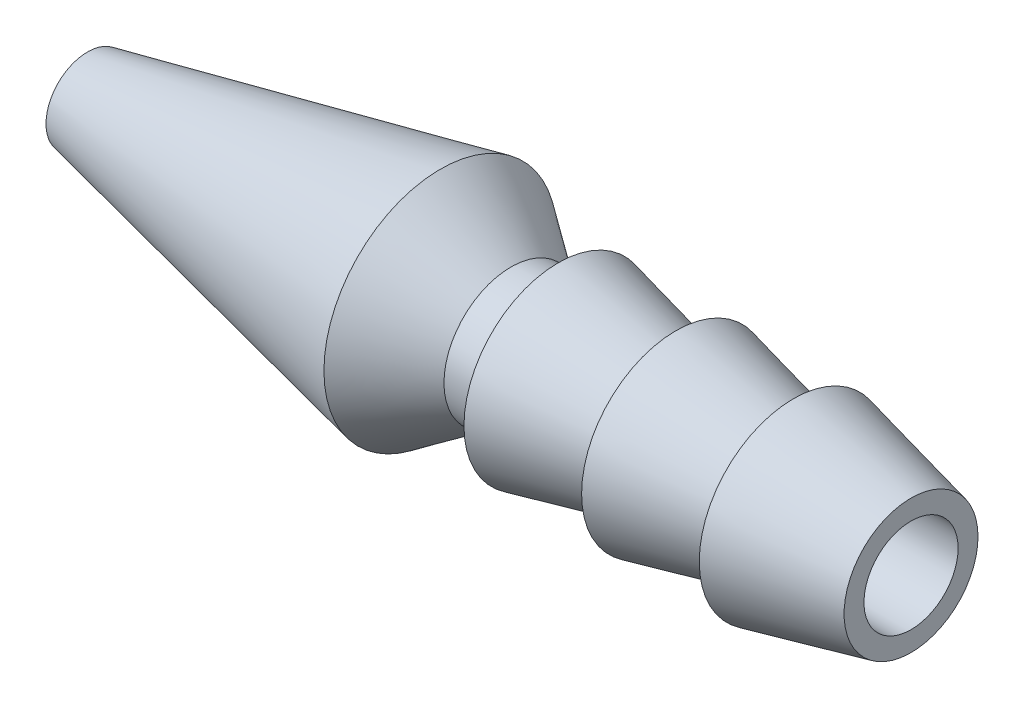
ISO-10303-21;
HEADER;
FILE_DESCRIPTION(('STEP AP214'),'2;1');
FILE_NAME('part.step','',(''),(''),'','','');
FILE_SCHEMA(('AUTOMOTIVE_DESIGN { 1 0 10303 214 1 1 1 1 }'));
ENDSEC;
DATA;
#1=APPLICATION_CONTEXT('core data for automotive mechanical design processes');
#2=APPLICATION_PROTOCOL_DEFINITION('international standard','automotive_design',2000,#1);
#3=PRODUCT_CONTEXT('',#1,'mechanical');
#4=PRODUCT('Part','Part','',(#3));
#5=PRODUCT_RELATED_PRODUCT_CATEGORY('part','',(#4));
#6=PRODUCT_DEFINITION_FORMATION('','',#4);
#7=PRODUCT_DEFINITION_CONTEXT('part definition',#1,'design');
#8=PRODUCT_DEFINITION('design','',#6,#7);
#9=PRODUCT_DEFINITION_SHAPE('','',#8);
#10=(LENGTH_UNIT() NAMED_UNIT(*) SI_UNIT(.MILLI.,.METRE.));
#11=(NAMED_UNIT(*) PLANE_ANGLE_UNIT() SI_UNIT($,.RADIAN.));
#12=(NAMED_UNIT(*) SI_UNIT($,.STERADIAN.) SOLID_ANGLE_UNIT());
#13=UNCERTAINTY_MEASURE_WITH_UNIT(LENGTH_MEASURE(1.E-05),#10,'distance_accuracy_value','');
#14=(GEOMETRIC_REPRESENTATION_CONTEXT(3) GLOBAL_UNCERTAINTY_ASSIGNED_CONTEXT((#13)) GLOBAL_UNIT_ASSIGNED_CONTEXT((#10,
#11,#12)) REPRESENTATION_CONTEXT('',''));
#15=CARTESIAN_POINT('',(0.,0.,0.));
#16=DIRECTION('',(0.,0.,1.));
#17=DIRECTION('',(1.,0.,0.));
#18=AXIS2_PLACEMENT_3D('',#15,#16,#17);
#19=CARTESIAN_POINT('',(0.,0.,0.));
#20=DIRECTION('',(-1.,0.,0.));
#21=DIRECTION('',(0.,0.,-1.));
#22=AXIS2_PLACEMENT_3D('',#19,#20,#21);
#23=CONICAL_SURFACE('',#22,4.,0.226892802759263);
#24=CARTESIAN_POINT('',(5.,0.,0.));
#25=DIRECTION('',(1.,0.,0.));
#26=DIRECTION('',(0.,0.,-1.));
#27=AXIS2_PLACEMENT_3D('',#24,#25,#26);
#28=CIRCLE('',#27,2.84565904437218);
#29=CARTESIAN_POINT('',(5.,0.,-2.84565904437218));
#30=VERTEX_POINT('',#29);
#31=EDGE_CURVE('E36',#30,#30,#28,.T.);
#32=ORIENTED_EDGE('',*,*,#31,.F.);
#33=EDGE_LOOP('',(#32));
#34=FACE_BOUND('',#33,.T.);
#35=CARTESIAN_POINT('',(0.,0.,0.));
#36=DIRECTION('',(1.,0.,0.));
#37=DIRECTION('',(0.,0.,-1.));
#38=AXIS2_PLACEMENT_3D('',#35,#36,#37);
#39=CIRCLE('',#38,4.);
#40=CARTESIAN_POINT('',(0.,0.,-4.));
#41=VERTEX_POINT('',#40);
#42=EDGE_CURVE('E44',#41,#41,#39,.T.);
#43=ORIENTED_EDGE('',*,*,#42,.T.);
#44=EDGE_LOOP('',(#43));
#45=FACE_BOUND('',#44,.T.);
#46=ADVANCED_FACE('F33',(#34,#45),#23,.T.);
#47=CARTESIAN_POINT('',(0.,0.,0.));
#48=DIRECTION('',(1.,0.,0.));
#49=DIRECTION('',(0.,0.,-1.));
#50=AXIS2_PLACEMENT_3D('',#47,#48,#49);
#51=PLANE('',#50);
#52=CARTESIAN_POINT('',(0.,0.,0.));
#53=DIRECTION('',(-1.,0.,0.));
#54=DIRECTION('',(0.,0.,1.));
#55=AXIS2_PLACEMENT_3D('',#52,#53,#54);
#56=CIRCLE('',#55,2.85);
#57=CARTESIAN_POINT('',(0.,0.,2.85));
#58=VERTEX_POINT('',#57);
#59=EDGE_CURVE('E10',#58,#58,#56,.T.);
#60=ORIENTED_EDGE('',*,*,#59,.F.);
#61=EDGE_LOOP('',(#60));
#62=FACE_BOUND('',#61,.T.);
#63=ORIENTED_EDGE('',*,*,#42,.F.);
#64=EDGE_LOOP('',(#63));
#65=FACE_BOUND('',#64,.T.);
#66=ADVANCED_FACE('F64',(#62,#65),#51,.F.);
#67=CARTESIAN_POINT('',(5.,0.,0.));
#68=DIRECTION('',(-1.,0.,0.));
#69=DIRECTION('',(0.,0.,-1.));
#70=AXIS2_PLACEMENT_3D('',#67,#68,#69);
#71=CONICAL_SURFACE('',#70,4.,0.226892802759263);
#72=CARTESIAN_POINT('',(10.,0.,0.));
#73=DIRECTION('',(1.,0.,0.));
#74=DIRECTION('',(0.,0.,-1.));
#75=AXIS2_PLACEMENT_3D('',#72,#73,#74);
#76=CIRCLE('',#75,2.84565904437218);
#77=CARTESIAN_POINT('',(10.,0.,-2.84565904437218));
#78=VERTEX_POINT('',#77);
#79=EDGE_CURVE('E58',#78,#78,#76,.T.);
#80=ORIENTED_EDGE('',*,*,#79,.F.);
#81=EDGE_LOOP('',(#80));
#82=FACE_BOUND('',#81,.T.);
#83=CARTESIAN_POINT('',(5.,0.,0.));
#84=DIRECTION('',(1.,0.,0.));
#85=DIRECTION('',(0.,0.,-1.));
#86=AXIS2_PLACEMENT_3D('',#83,#84,#85);
#87=CIRCLE('',#86,4.);
#88=CARTESIAN_POINT('',(5.,0.,-4.));
#89=VERTEX_POINT('',#88);
#90=EDGE_CURVE('E55',#89,#89,#87,.T.);
#91=ORIENTED_EDGE('',*,*,#90,.T.);
#92=EDGE_LOOP('',(#91));
#93=FACE_BOUND('',#92,.T.);
#94=ADVANCED_FACE('F66',(#82,#93),#71,.T.);
#95=CARTESIAN_POINT('',(5.,0.,0.));
#96=DIRECTION('',(1.,0.,0.));
#97=DIRECTION('',(0.,0.,-1.));
#98=AXIS2_PLACEMENT_3D('',#95,#96,#97);
#99=PLANE('',#98);
#100=ORIENTED_EDGE('',*,*,#31,.T.);
#101=EDGE_LOOP('',(#100));
#102=FACE_BOUND('',#101,.T.);
#103=ORIENTED_EDGE('',*,*,#90,.F.);
#104=EDGE_LOOP('',(#103));
#105=FACE_BOUND('',#104,.T.);
#106=ADVANCED_FACE('F72',(#102,#105),#99,.F.);
#107=CARTESIAN_POINT('',(10.,0.,0.));
#108=DIRECTION('',(-1.,0.,0.));
#109=DIRECTION('',(0.,0.,-1.));
#110=AXIS2_PLACEMENT_3D('',#107,#108,#109);
#111=CONICAL_SURFACE('',#110,4.,0.226892802759263);
#112=CARTESIAN_POINT('',(15.,0.,0.));
#113=DIRECTION('',(1.,0.,0.));
#114=DIRECTION('',(0.,0.,-1.));
#115=AXIS2_PLACEMENT_3D('',#112,#113,#114);
#116=CIRCLE('',#115,2.84565904437218);
#117=CARTESIAN_POINT('',(15.,0.,-2.84565904437218));
#118=VERTEX_POINT('',#117);
#119=EDGE_CURVE('E52',#118,#118,#116,.T.);
#120=ORIENTED_EDGE('',*,*,#119,.F.);
#121=EDGE_LOOP('',(#120));
#122=FACE_BOUND('',#121,.T.);
#123=CARTESIAN_POINT('',(10.,0.,0.));
#124=DIRECTION('',(1.,0.,0.));
#125=DIRECTION('',(0.,0.,-1.));
#126=AXIS2_PLACEMENT_3D('',#123,#124,#125);
#127=CIRCLE('',#126,4.);
#128=CARTESIAN_POINT('',(10.,0.,-4.));
#129=VERTEX_POINT('',#128);
#130=EDGE_CURVE('E49',#129,#129,#127,.T.);
#131=ORIENTED_EDGE('',*,*,#130,.T.);
#132=EDGE_LOOP('',(#131));
#133=FACE_BOUND('',#132,.T.);
#134=ADVANCED_FACE('F79',(#122,#133),#111,.T.);
#135=CARTESIAN_POINT('',(15.,0.,0.));
#136=DIRECTION('',(1.,0.,0.));
#137=DIRECTION('',(0.,0.,-1.));
#138=AXIS2_PLACEMENT_3D('',#135,#136,#137);
#139=PLANE('',#138);
#140=CARTESIAN_POINT('',(15.,0.,0.));
#141=DIRECTION('',(1.,0.,0.));
#142=DIRECTION('',(0.,0.,-1.));
#143=AXIS2_PLACEMENT_3D('',#140,#141,#142);
#144=CIRCLE('',#143,2.);
#145=CARTESIAN_POINT('',(15.,0.,-2.));
#146=VERTEX_POINT('',#145);
#147=EDGE_CURVE('E129',#146,#146,#144,.T.);
#148=ORIENTED_EDGE('',*,*,#147,.F.);
#149=EDGE_LOOP('',(#148));
#150=FACE_BOUND('',#149,.T.);
#151=ORIENTED_EDGE('',*,*,#119,.T.);
#152=EDGE_LOOP('',(#151));
#153=FACE_BOUND('',#152,.T.);
#154=ADVANCED_FACE('F83',(#150,#153),#139,.T.);
#155=CARTESIAN_POINT('',(10.,0.,0.));
#156=DIRECTION('',(1.,0.,0.));
#157=DIRECTION('',(0.,0.,-1.));
#158=AXIS2_PLACEMENT_3D('',#155,#156,#157);
#159=PLANE('',#158);
#160=ORIENTED_EDGE('',*,*,#79,.T.);
#161=EDGE_LOOP('',(#160));
#162=FACE_BOUND('',#161,.T.);
#163=ORIENTED_EDGE('',*,*,#130,.F.);
#164=EDGE_LOOP('',(#163));
#165=FACE_BOUND('',#164,.T.);
#166=ADVANCED_FACE('F85',(#162,#165),#159,.F.);
#167=CARTESIAN_POINT('',(-2.,0.,0.));
#168=DIRECTION('',(1.,0.,0.));
#169=DIRECTION('',(0.,0.,-1.));
#170=AXIS2_PLACEMENT_3D('',#167,#168,#169);
#171=CYLINDRICAL_SURFACE('',#170,2.85);
#172=CARTESIAN_POINT('',(-2.,0.,0.));
#173=DIRECTION('',(-1.,0.,0.));
#174=DIRECTION('',(0.,0.,1.));
#175=AXIS2_PLACEMENT_3D('',#172,#173,#174);
#176=CIRCLE('',#175,2.85);
#177=CARTESIAN_POINT('',(-2.,0.,2.85));
#178=VERTEX_POINT('',#177);
#179=EDGE_CURVE('E47',#178,#178,#176,.T.);
#180=ORIENTED_EDGE('',*,*,#179,.F.);
#181=EDGE_LOOP('',(#180));
#182=FACE_BOUND('',#181,.T.);
#183=ORIENTED_EDGE('',*,*,#59,.T.);
#184=EDGE_LOOP('',(#183));
#185=FACE_BOUND('',#184,.T.);
#186=ADVANCED_FACE('F88',(#182,#185),#171,.T.);
#187=CARTESIAN_POINT('',(-2.,0.,0.));
#188=DIRECTION('',(-1.,0.,0.));
#189=DIRECTION('',(0.,0.,1.));
#190=AXIS2_PLACEMENT_3D('',#187,#188,#189);
#191=CONICAL_SURFACE('',#190,2.85,0.610865238198016);
#192=CARTESIAN_POINT('',(-5.,0.,0.));
#193=DIRECTION('',(-1.,0.,0.));
#194=DIRECTION('',(0.,0.,1.));
#195=AXIS2_PLACEMENT_3D('',#192,#193,#194);
#196=CIRCLE('',#195,4.95062261462913);
#197=CARTESIAN_POINT('',(-5.,0.,4.95062261462913));
#198=VERTEX_POINT('',#197);
#199=EDGE_CURVE('E139',#198,#198,#196,.T.);
#200=ORIENTED_EDGE('',*,*,#199,.F.);
#201=EDGE_LOOP('',(#200));
#202=FACE_BOUND('',#201,.T.);
#203=ORIENTED_EDGE('',*,*,#179,.T.);
#204=EDGE_LOOP('',(#203));
#205=FACE_BOUND('',#204,.T.);
#206=ADVANCED_FACE('F95',(#202,#205),#191,.T.);
#207=CARTESIAN_POINT('',(-5.,0.,0.));
#208=DIRECTION('',(1.,0.,0.));
#209=DIRECTION('',(0.,0.,1.));
#210=AXIS2_PLACEMENT_3D('',#207,#208,#209);
#211=CONICAL_SURFACE('',#210,4.95062261462913,0.20943951023932);
#212=CARTESIAN_POINT('',(-20.,0.,0.));
#213=DIRECTION('',(-1.,0.,0.));
#214=DIRECTION('',(0.,0.,1.));
#215=AXIS2_PLACEMENT_3D('',#212,#213,#214);
#216=CIRCLE('',#215,1.7622741895788);
#217=CARTESIAN_POINT('',(-20.,0.,1.7622741895788));
#218=VERTEX_POINT('',#217);
#219=EDGE_CURVE('E135',#218,#218,#216,.T.);
#220=ORIENTED_EDGE('',*,*,#219,.F.);
#221=EDGE_LOOP('',(#220));
#222=FACE_BOUND('',#221,.T.);
#223=ORIENTED_EDGE('',*,*,#199,.T.);
#224=EDGE_LOOP('',(#223));
#225=FACE_BOUND('',#224,.T.);
#226=ADVANCED_FACE('F99',(#222,#225),#211,.T.);
#227=CARTESIAN_POINT('',(-20.,0.,0.));
#228=DIRECTION('',(-1.,0.,0.));
#229=DIRECTION('',(0.,0.,1.));
#230=AXIS2_PLACEMENT_3D('',#227,#228,#229);
#231=PLANE('',#230);
#232=CARTESIAN_POINT('',(-20.,0.,0.));
#233=DIRECTION('',(-1.,0.,0.));
#234=DIRECTION('',(0.,0.,1.));
#235=AXIS2_PLACEMENT_3D('',#232,#233,#234);
#236=CIRCLE('',#235,1.25);
#237=CARTESIAN_POINT('',(-20.,0.,1.25));
#238=VERTEX_POINT('',#237);
#239=EDGE_CURVE('E127',#238,#238,#236,.T.);
#240=ORIENTED_EDGE('',*,*,#239,.F.);
#241=EDGE_LOOP('',(#240));
#242=FACE_BOUND('',#241,.T.);
#243=ORIENTED_EDGE('',*,*,#219,.T.);
#244=EDGE_LOOP('',(#243));
#245=FACE_BOUND('',#244,.T.);
#246=ADVANCED_FACE('F103',(#242,#245),#231,.T.);
#247=CARTESIAN_POINT('',(-5.,0.,0.));
#248=DIRECTION('',(1.,0.,0.));
#249=DIRECTION('',(0.,0.,-1.));
#250=AXIS2_PLACEMENT_3D('',#247,#248,#249);
#251=CYLINDRICAL_SURFACE('',#250,2.);
#252=CARTESIAN_POINT('',(-5.,0.,0.));
#253=DIRECTION('',(1.,0.,0.));
#254=DIRECTION('',(0.,0.,-1.));
#255=AXIS2_PLACEMENT_3D('',#252,#253,#254);
#256=CIRCLE('',#255,2.);
#257=CARTESIAN_POINT('',(-5.,0.,-2.));
#258=VERTEX_POINT('',#257);
#259=EDGE_CURVE('E132',#258,#258,#256,.T.);
#260=ORIENTED_EDGE('',*,*,#259,.F.);
#261=EDGE_LOOP('',(#260));
#262=FACE_BOUND('',#261,.T.);
#263=ORIENTED_EDGE('',*,*,#147,.T.);
#264=EDGE_LOOP('',(#263));
#265=FACE_BOUND('',#264,.T.);
#266=ADVANCED_FACE('F107',(#262,#265),#251,.F.);
#267=CARTESIAN_POINT('',(-5.,0.,0.));
#268=DIRECTION('',(1.,0.,0.));
#269=DIRECTION('',(0.,0.,-1.));
#270=AXIS2_PLACEMENT_3D('',#267,#268,#269);
#271=PLANE('',#270);
#272=CARTESIAN_POINT('',(-5.,0.,0.));
#273=DIRECTION('',(-1.,0.,0.));
#274=DIRECTION('',(0.,0.,1.));
#275=AXIS2_PLACEMENT_3D('',#272,#273,#274);
#276=CIRCLE('',#275,1.98362239131268);
#277=CARTESIAN_POINT('',(-5.,0.,1.98362239131268));
#278=VERTEX_POINT('',#277);
#279=EDGE_CURVE('E124',#278,#278,#276,.T.);
#280=ORIENTED_EDGE('',*,*,#279,.T.);
#281=EDGE_LOOP('',(#280));
#282=FACE_BOUND('',#281,.T.);
#283=ORIENTED_EDGE('',*,*,#259,.T.);
#284=EDGE_LOOP('',(#283));
#285=FACE_BOUND('',#284,.T.);
#286=ADVANCED_FACE('F111',(#282,#285),#271,.T.);
#287=CARTESIAN_POINT('',(-20.,0.,0.));
#288=DIRECTION('',(1.,0.,0.));
#289=DIRECTION('',(0.,0.,1.));
#290=AXIS2_PLACEMENT_3D('',#287,#288,#289);
#291=CONICAL_SURFACE('',#290,1.25,0.0488692190558415);
#292=ORIENTED_EDGE('',*,*,#279,.F.);
#293=EDGE_LOOP('',(#292));
#294=FACE_BOUND('',#293,.T.);
#295=ORIENTED_EDGE('',*,*,#239,.T.);
#296=EDGE_LOOP('',(#295));
#297=FACE_BOUND('',#296,.T.);
#298=ADVANCED_FACE('F115',(#294,#297),#291,.F.);
#299=CLOSED_SHELL('',(#46,#66,#94,#106,#134,#154,#166,#186,#206,#226,#246,#266,#286,#298));
#300=MANIFOLD_SOLID_BREP('B2',#299);
#301=ADVANCED_BREP_SHAPE_REPRESENTATION('',(#18,#300),#14);
#302=SHAPE_DEFINITION_REPRESENTATION(#9,#301);
ENDSEC;
END-ISO-10303-21;
